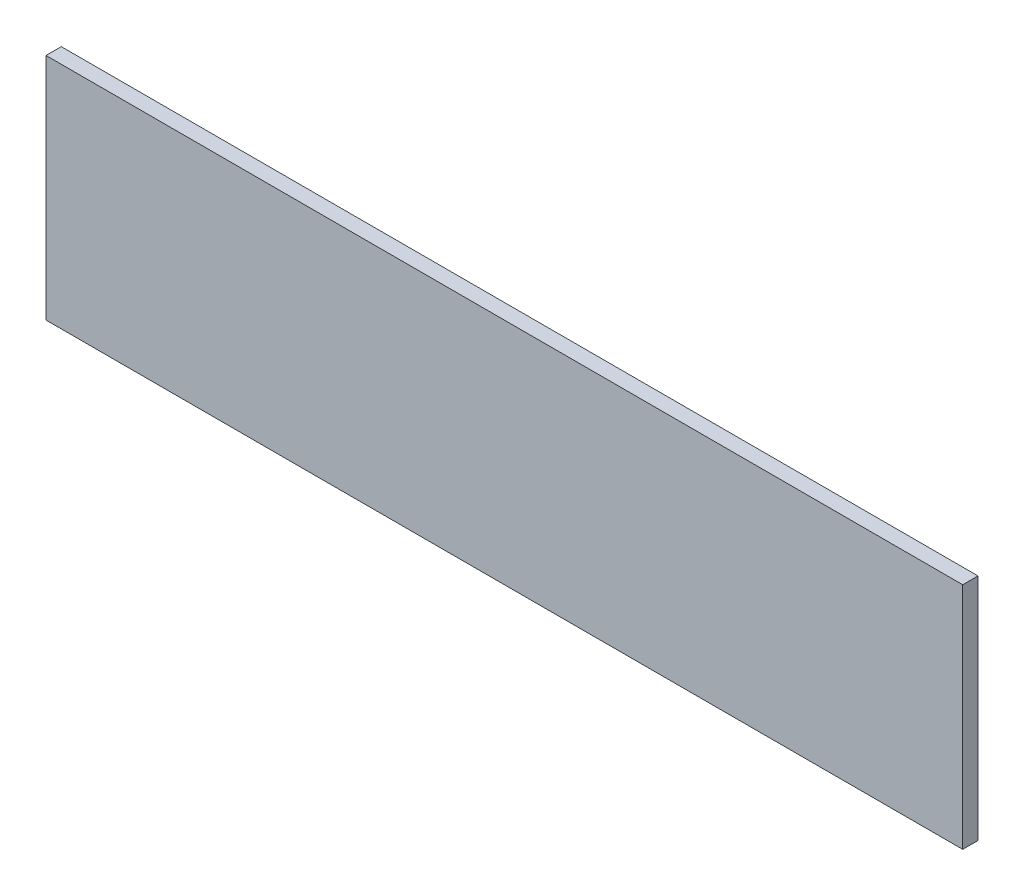
ISO-10303-21;
HEADER;
FILE_DESCRIPTION(('STEP AP214'),'2;1');
FILE_NAME('part.step','',(''),(''),'','','');
FILE_SCHEMA(('AUTOMOTIVE_DESIGN { 1 0 10303 214 1 1 1 1 }'));
ENDSEC;
DATA;
#1=APPLICATION_CONTEXT('core data for automotive mechanical design processes');
#2=APPLICATION_PROTOCOL_DEFINITION('international standard','automotive_design',2000,#1);
#3=PRODUCT_CONTEXT('',#1,'mechanical');
#4=PRODUCT('Part','Part','',(#3));
#5=PRODUCT_RELATED_PRODUCT_CATEGORY('part','',(#4));
#6=PRODUCT_DEFINITION_FORMATION('','',#4);
#7=PRODUCT_DEFINITION_CONTEXT('part definition',#1,'design');
#8=PRODUCT_DEFINITION('design','',#6,#7);
#9=PRODUCT_DEFINITION_SHAPE('','',#8);
#10=(LENGTH_UNIT() NAMED_UNIT(*) SI_UNIT(.MILLI.,.METRE.));
#11=(NAMED_UNIT(*) PLANE_ANGLE_UNIT() SI_UNIT($,.RADIAN.));
#12=(NAMED_UNIT(*) SI_UNIT($,.STERADIAN.) SOLID_ANGLE_UNIT());
#13=UNCERTAINTY_MEASURE_WITH_UNIT(LENGTH_MEASURE(1.E-05),#10,'distance_accuracy_value','');
#14=(GEOMETRIC_REPRESENTATION_CONTEXT(3) GLOBAL_UNCERTAINTY_ASSIGNED_CONTEXT((#13)) GLOBAL_UNIT_ASSIGNED_CONTEXT((#10,
#11,#12)) REPRESENTATION_CONTEXT('',''));
#15=CARTESIAN_POINT('',(0.,0.,0.));
#16=DIRECTION('',(0.,0.,1.));
#17=DIRECTION('',(1.,0.,0.));
#18=AXIS2_PLACEMENT_3D('',#15,#16,#17);
#19=CARTESIAN_POINT('',(0.,0.,2.));
#20=DIRECTION('',(1.,0.,0.));
#21=DIRECTION('',(0.,0.,-1.));
#22=AXIS2_PLACEMENT_3D('',#19,#20,#21);
#23=PLANE('',#22);
#24=DIRECTION('',(0.,-1.,0.));
#25=VECTOR('',#24,1.);
#26=CARTESIAN_POINT('',(0.,0.,0.));
#27=LINE('',#26,#25);
#28=CARTESIAN_POINT('',(0.,30.,0.));
#29=VERTEX_POINT('',#28);
#30=CARTESIAN_POINT('',(0.,0.,0.));
#31=VERTEX_POINT('',#30);
#32=EDGE_CURVE('E170',#29,#31,#27,.T.);
#33=ORIENTED_EDGE('',*,*,#32,.T.);
#34=DIRECTION('',(0.,0.,-1.));
#35=VECTOR('',#34,1.);
#36=CARTESIAN_POINT('',(0.,0.,2.));
#37=LINE('',#36,#35);
#38=CARTESIAN_POINT('',(0.,0.,2.));
#39=VERTEX_POINT('',#38);
#40=EDGE_CURVE('E12',#39,#31,#37,.T.);
#41=ORIENTED_EDGE('',*,*,#40,.F.);
#42=DIRECTION('',(0.,-1.,0.));
#43=VECTOR('',#42,1.);
#44=CARTESIAN_POINT('',(0.,0.,2.));
#45=LINE('',#44,#43);
#46=CARTESIAN_POINT('',(0.,30.,2.));
#47=VERTEX_POINT('',#46);
#48=EDGE_CURVE('E98',#47,#39,#45,.T.);
#49=ORIENTED_EDGE('',*,*,#48,.F.);
#50=DIRECTION('',(0.,0.,-1.));
#51=VECTOR('',#50,1.);
#52=CARTESIAN_POINT('',(0.,30.,2.));
#53=LINE('',#52,#51);
#54=EDGE_CURVE('E111',#47,#29,#53,.T.);
#55=ORIENTED_EDGE('',*,*,#54,.T.);
#56=EDGE_LOOP('',(#33,#41,#49,#55));
#57=FACE_BOUND('',#56,.T.);
#58=ADVANCED_FACE('F45',(#57),#23,.F.);
#59=CARTESIAN_POINT('',(0.,0.,2.));
#60=DIRECTION('',(0.,1.,0.));
#61=DIRECTION('',(0.,0.,1.));
#62=AXIS2_PLACEMENT_3D('',#59,#60,#61);
#63=PLANE('',#62);
#64=DIRECTION('',(1.,0.,0.));
#65=VECTOR('',#64,1.);
#66=CARTESIAN_POINT('',(0.,0.,0.));
#67=LINE('',#66,#65);
#68=CARTESIAN_POINT('',(120.,0.,0.));
#69=VERTEX_POINT('',#68);
#70=EDGE_CURVE('E103',#31,#69,#67,.T.);
#71=ORIENTED_EDGE('',*,*,#70,.T.);
#72=DIRECTION('',(0.,0.,-1.));
#73=VECTOR('',#72,1.);
#74=CARTESIAN_POINT('',(120.,0.,2.));
#75=LINE('',#74,#73);
#76=CARTESIAN_POINT('',(120.,0.,2.));
#77=VERTEX_POINT('',#76);
#78=EDGE_CURVE('E54',#77,#69,#75,.T.);
#79=ORIENTED_EDGE('',*,*,#78,.F.);
#80=DIRECTION('',(1.,0.,0.));
#81=VECTOR('',#80,1.);
#82=CARTESIAN_POINT('',(0.,0.,2.));
#83=LINE('',#82,#81);
#84=EDGE_CURVE('E92',#39,#77,#83,.T.);
#85=ORIENTED_EDGE('',*,*,#84,.F.);
#86=ORIENTED_EDGE('',*,*,#40,.T.);
#87=EDGE_LOOP('',(#71,#79,#85,#86));
#88=FACE_BOUND('',#87,.T.);
#89=ADVANCED_FACE('F102',(#88),#63,.F.);
#90=CARTESIAN_POINT('',(120.,0.,2.));
#91=DIRECTION('',(-1.,0.,0.));
#92=DIRECTION('',(0.,0.,1.));
#93=AXIS2_PLACEMENT_3D('',#90,#91,#92);
#94=PLANE('',#93);
#95=DIRECTION('',(0.,1.,0.));
#96=VECTOR('',#95,1.);
#97=CARTESIAN_POINT('',(120.,0.,0.));
#98=LINE('',#97,#96);
#99=CARTESIAN_POINT('',(120.,30.,0.));
#100=VERTEX_POINT('',#99);
#101=EDGE_CURVE('E79',#69,#100,#98,.T.);
#102=ORIENTED_EDGE('',*,*,#101,.T.);
#103=DIRECTION('',(0.,0.,-1.));
#104=VECTOR('',#103,1.);
#105=CARTESIAN_POINT('',(120.,30.,2.));
#106=LINE('',#105,#104);
#107=CARTESIAN_POINT('',(120.,30.,2.));
#108=VERTEX_POINT('',#107);
#109=EDGE_CURVE('E105',#108,#100,#106,.T.);
#110=ORIENTED_EDGE('',*,*,#109,.F.);
#111=DIRECTION('',(0.,1.,0.));
#112=VECTOR('',#111,1.);
#113=CARTESIAN_POINT('',(120.,0.,2.));
#114=LINE('',#113,#112);
#115=EDGE_CURVE('E96',#77,#108,#114,.T.);
#116=ORIENTED_EDGE('',*,*,#115,.F.);
#117=ORIENTED_EDGE('',*,*,#78,.T.);
#118=EDGE_LOOP('',(#102,#110,#116,#117));
#119=FACE_BOUND('',#118,.T.);
#120=ADVANCED_FACE('F106',(#119),#94,.F.);
#121=CARTESIAN_POINT('',(0.,30.,2.));
#122=DIRECTION('',(0.,-1.,0.));
#123=DIRECTION('',(1.,0.,0.));
#124=AXIS2_PLACEMENT_3D('',#121,#122,#123);
#125=PLANE('',#124);
#126=DIRECTION('',(-1.,0.,0.));
#127=VECTOR('',#126,1.);
#128=CARTESIAN_POINT('',(0.,30.,0.));
#129=LINE('',#128,#127);
#130=EDGE_CURVE('E85',#100,#29,#129,.T.);
#131=ORIENTED_EDGE('',*,*,#130,.T.);
#132=ORIENTED_EDGE('',*,*,#54,.F.);
#133=DIRECTION('',(-1.,0.,0.));
#134=VECTOR('',#133,1.);
#135=CARTESIAN_POINT('',(0.,30.,2.));
#136=LINE('',#135,#134);
#137=EDGE_CURVE('E62',#108,#47,#136,.T.);
#138=ORIENTED_EDGE('',*,*,#137,.F.);
#139=ORIENTED_EDGE('',*,*,#109,.T.);
#140=EDGE_LOOP('',(#131,#132,#138,#139));
#141=FACE_BOUND('',#140,.T.);
#142=ADVANCED_FACE('F165',(#141),#125,.F.);
#143=CARTESIAN_POINT('',(0.,0.,2.));
#144=DIRECTION('',(0.,0.,-1.));
#145=DIRECTION('',(-1.,0.,0.));
#146=AXIS2_PLACEMENT_3D('',#143,#144,#145);
#147=PLANE('',#146);
#148=ORIENTED_EDGE('',*,*,#48,.T.);
#149=ORIENTED_EDGE('',*,*,#84,.T.);
#150=ORIENTED_EDGE('',*,*,#115,.T.);
#151=ORIENTED_EDGE('',*,*,#137,.T.);
#152=EDGE_LOOP('',(#148,#149,#150,#151));
#153=FACE_BOUND('',#152,.T.);
#154=ADVANCED_FACE('F94',(#153),#147,.F.);
#155=CARTESIAN_POINT('',(0.,0.,0.));
#156=DIRECTION('',(0.,0.,-1.));
#157=DIRECTION('',(-1.,0.,0.));
#158=AXIS2_PLACEMENT_3D('',#155,#156,#157);
#159=PLANE('',#158);
#160=ORIENTED_EDGE('',*,*,#32,.F.);
#161=ORIENTED_EDGE('',*,*,#130,.F.);
#162=ORIENTED_EDGE('',*,*,#101,.F.);
#163=ORIENTED_EDGE('',*,*,#70,.F.);
#164=EDGE_LOOP('',(#160,#161,#162,#163));
#165=FACE_BOUND('',#164,.T.);
#166=ADVANCED_FACE('F168',(#165),#159,.T.);
#167=CLOSED_SHELL('',(#58,#89,#120,#142,#154,#166));
#168=MANIFOLD_SOLID_BREP('B2',#167);
#169=ADVANCED_BREP_SHAPE_REPRESENTATION('',(#18,#168),#14);
#170=SHAPE_DEFINITION_REPRESENTATION(#9,#169);
ENDSEC;
END-ISO-10303-21;
